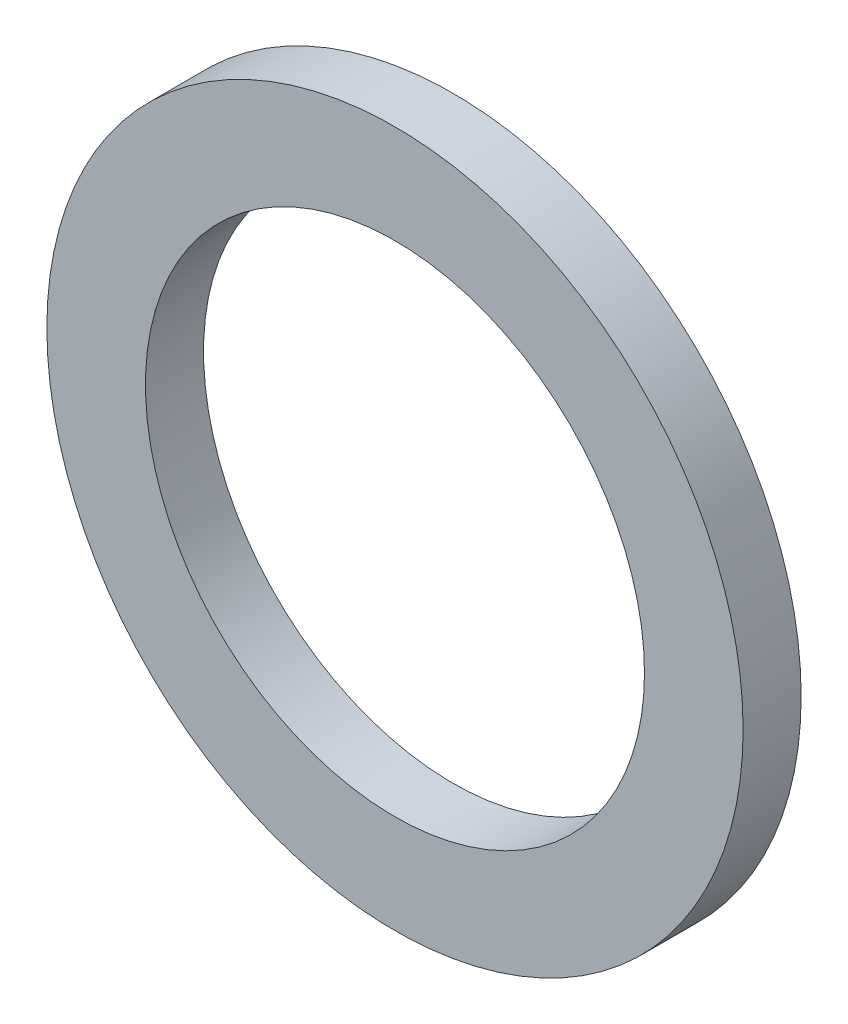
ISO-10303-21;
HEADER;
FILE_DESCRIPTION(('STEP AP214'),'2;1');
FILE_NAME('part.step','',(''),(''),'','','');
FILE_SCHEMA(('AUTOMOTIVE_DESIGN { 1 0 10303 214 1 1 1 1 }'));
ENDSEC;
DATA;
#1=APPLICATION_CONTEXT('core data for automotive mechanical design processes');
#2=APPLICATION_PROTOCOL_DEFINITION('international standard','automotive_design',2000,#1);
#3=PRODUCT_CONTEXT('',#1,'mechanical');
#4=PRODUCT('Part','Part','',(#3));
#5=PRODUCT_RELATED_PRODUCT_CATEGORY('part','',(#4));
#6=PRODUCT_DEFINITION_FORMATION('','',#4);
#7=PRODUCT_DEFINITION_CONTEXT('part definition',#1,'design');
#8=PRODUCT_DEFINITION('design','',#6,#7);
#9=PRODUCT_DEFINITION_SHAPE('','',#8);
#10=(LENGTH_UNIT() NAMED_UNIT(*) SI_UNIT(.MILLI.,.METRE.));
#11=(NAMED_UNIT(*) PLANE_ANGLE_UNIT() SI_UNIT($,.RADIAN.));
#12=(NAMED_UNIT(*) SI_UNIT($,.STERADIAN.) SOLID_ANGLE_UNIT());
#13=UNCERTAINTY_MEASURE_WITH_UNIT(LENGTH_MEASURE(1.E-05),#10,'distance_accuracy_value','');
#14=(GEOMETRIC_REPRESENTATION_CONTEXT(3) GLOBAL_UNCERTAINTY_ASSIGNED_CONTEXT((#13)) GLOBAL_UNIT_ASSIGNED_CONTEXT((#10,
#11,#12)) REPRESENTATION_CONTEXT('',''));
#15=CARTESIAN_POINT('',(0.,0.,0.));
#16=DIRECTION('',(0.,0.,1.));
#17=DIRECTION('',(1.,0.,0.));
#18=AXIS2_PLACEMENT_3D('',#15,#16,#17);
#19=CARTESIAN_POINT('',(0.,0.,1.));
#20=DIRECTION('',(0.,0.,-1.));
#21=DIRECTION('',(-1.,0.,0.));
#22=AXIS2_PLACEMENT_3D('',#19,#20,#21);
#23=CYLINDRICAL_SURFACE('',#22,6.);
#24=CARTESIAN_POINT('',(0.,0.,1.));
#25=DIRECTION('',(0.,0.,1.));
#26=DIRECTION('',(1.,0.,0.));
#27=AXIS2_PLACEMENT_3D('',#24,#25,#26);
#28=CIRCLE('',#27,6.);
#29=CARTESIAN_POINT('',(6.,0.,1.));
#30=VERTEX_POINT('',#29);
#31=EDGE_CURVE('E10',#30,#30,#28,.T.);
#32=ORIENTED_EDGE('',*,*,#31,.F.);
#33=EDGE_LOOP('',(#32));
#34=FACE_BOUND('',#33,.T.);
#35=CARTESIAN_POINT('',(0.,0.,0.));
#36=DIRECTION('',(0.,0.,1.));
#37=DIRECTION('',(1.,0.,0.));
#38=AXIS2_PLACEMENT_3D('',#35,#36,#37);
#39=CIRCLE('',#38,6.);
#40=CARTESIAN_POINT('',(6.,0.,0.));
#41=VERTEX_POINT('',#40);
#42=EDGE_CURVE('E44',#41,#41,#39,.T.);
#43=ORIENTED_EDGE('',*,*,#42,.T.);
#44=EDGE_LOOP('',(#43));
#45=FACE_BOUND('',#44,.T.);
#46=ADVANCED_FACE('F37',(#34,#45),#23,.T.);
#47=CARTESIAN_POINT('',(0.,0.,1.));
#48=DIRECTION('',(0.,0.,1.));
#49=DIRECTION('',(1.,0.,0.));
#50=AXIS2_PLACEMENT_3D('',#47,#48,#49);
#51=PLANE('',#50);
#52=CARTESIAN_POINT('',(0.,0.,1.));
#53=DIRECTION('',(0.,0.,1.));
#54=DIRECTION('',(1.,0.,0.));
#55=AXIS2_PLACEMENT_3D('',#52,#53,#54);
#56=CIRCLE('',#55,4.3);
#57=CARTESIAN_POINT('',(4.3,0.,1.));
#58=VERTEX_POINT('',#57);
#59=EDGE_CURVE('E49',#58,#58,#56,.F.);
#60=ORIENTED_EDGE('',*,*,#59,.T.);
#61=EDGE_LOOP('',(#60));
#62=FACE_BOUND('',#61,.T.);
#63=ORIENTED_EDGE('',*,*,#31,.T.);
#64=EDGE_LOOP('',(#63));
#65=FACE_BOUND('',#64,.T.);
#66=ADVANCED_FACE('F62',(#62,#65),#51,.T.);
#67=CARTESIAN_POINT('',(0.,0.,0.));
#68=DIRECTION('',(0.,0.,1.));
#69=DIRECTION('',(1.,0.,0.));
#70=AXIS2_PLACEMENT_3D('',#67,#68,#69);
#71=PLANE('',#70);
#72=CARTESIAN_POINT('',(0.,0.,0.));
#73=DIRECTION('',(0.,0.,1.));
#74=DIRECTION('',(1.,0.,0.));
#75=AXIS2_PLACEMENT_3D('',#72,#73,#74);
#76=CIRCLE('',#75,4.3);
#77=CARTESIAN_POINT('',(4.3,0.,0.));
#78=VERTEX_POINT('',#77);
#79=EDGE_CURVE('E40',#78,#78,#76,.F.);
#80=ORIENTED_EDGE('',*,*,#79,.F.);
#81=EDGE_LOOP('',(#80));
#82=FACE_BOUND('',#81,.T.);
#83=ORIENTED_EDGE('',*,*,#42,.F.);
#84=EDGE_LOOP('',(#83));
#85=FACE_BOUND('',#84,.T.);
#86=ADVANCED_FACE('F59',(#82,#85),#71,.F.);
#87=CARTESIAN_POINT('',(0.,0.,1.1));
#88=DIRECTION('',(0.,0.,-1.));
#89=DIRECTION('',(-1.,0.,0.));
#90=AXIS2_PLACEMENT_3D('',#87,#88,#89);
#91=CYLINDRICAL_SURFACE('',#90,4.3);
#92=ORIENTED_EDGE('',*,*,#59,.F.);
#93=EDGE_LOOP('',(#92));
#94=FACE_BOUND('',#93,.T.);
#95=ORIENTED_EDGE('',*,*,#79,.T.);
#96=EDGE_LOOP('',(#95));
#97=FACE_BOUND('',#96,.T.);
#98=ADVANCED_FACE('F57',(#94,#97),#91,.F.);
#99=CLOSED_SHELL('',(#46,#66,#86,#98));
#100=MANIFOLD_SOLID_BREP('B2',#99);
#101=ADVANCED_BREP_SHAPE_REPRESENTATION('',(#18,#100),#14);
#102=SHAPE_DEFINITION_REPRESENTATION(#9,#101);
ENDSEC;
END-ISO-10303-21;
